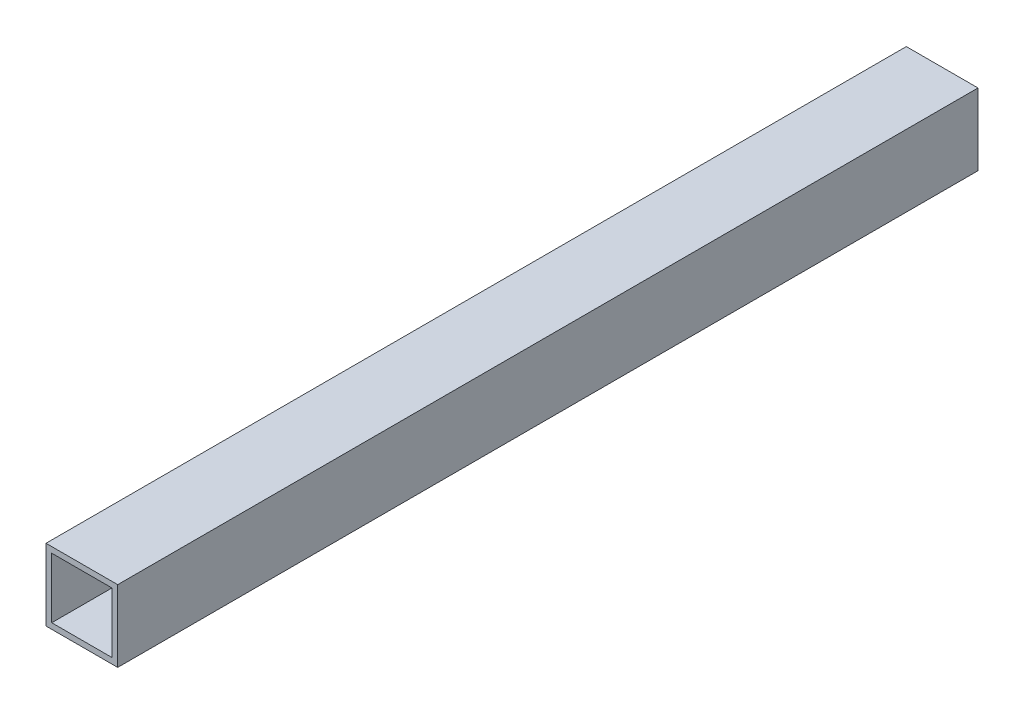
ISO-10303-21;
HEADER;
FILE_DESCRIPTION(('STEP AP214'),'2;1');
FILE_NAME('part.step','',(''),(''),'','','');
FILE_SCHEMA(('AUTOMOTIVE_DESIGN { 1 0 10303 214 1 1 1 1 }'));
ENDSEC;
DATA;
#1=APPLICATION_CONTEXT('core data for automotive mechanical design processes');
#2=APPLICATION_PROTOCOL_DEFINITION('international standard','automotive_design',2000,#1);
#3=PRODUCT_CONTEXT('',#1,'mechanical');
#4=PRODUCT('Part','Part','',(#3));
#5=PRODUCT_RELATED_PRODUCT_CATEGORY('part','',(#4));
#6=PRODUCT_DEFINITION_FORMATION('','',#4);
#7=PRODUCT_DEFINITION_CONTEXT('part definition',#1,'design');
#8=PRODUCT_DEFINITION('design','',#6,#7);
#9=PRODUCT_DEFINITION_SHAPE('','',#8);
#10=(LENGTH_UNIT() NAMED_UNIT(*) SI_UNIT(.MILLI.,.METRE.));
#11=(NAMED_UNIT(*) PLANE_ANGLE_UNIT() SI_UNIT($,.RADIAN.));
#12=(NAMED_UNIT(*) SI_UNIT($,.STERADIAN.) SOLID_ANGLE_UNIT());
#13=UNCERTAINTY_MEASURE_WITH_UNIT(LENGTH_MEASURE(1.E-05),#10,'distance_accuracy_value','');
#14=(GEOMETRIC_REPRESENTATION_CONTEXT(3) GLOBAL_UNCERTAINTY_ASSIGNED_CONTEXT((#13)) GLOBAL_UNIT_ASSIGNED_CONTEXT((#10,
#11,#12)) REPRESENTATION_CONTEXT('',''));
#15=CARTESIAN_POINT('',(0.,0.,0.));
#16=DIRECTION('',(0.,0.,1.));
#17=DIRECTION('',(1.,0.,0.));
#18=AXIS2_PLACEMENT_3D('',#15,#16,#17);
#19=CARTESIAN_POINT('',(0.,0.,300.));
#20=DIRECTION('',(0.,0.,-1.));
#21=DIRECTION('',(-1.,0.,0.));
#22=AXIS2_PLACEMENT_3D('',#19,#20,#21);
#23=PLANE('',#22);
#24=DIRECTION('',(0.,1.,0.));
#25=VECTOR('',#24,1.);
#26=CARTESIAN_POINT('',(12.5,-12.5,300.));
#27=LINE('',#26,#25);
#28=CARTESIAN_POINT('',(12.5,-12.5,300.));
#29=VERTEX_POINT('',#28);
#30=CARTESIAN_POINT('',(12.5,12.5,300.));
#31=VERTEX_POINT('',#30);
#32=EDGE_CURVE('E137',#29,#31,#27,.T.);
#33=ORIENTED_EDGE('',*,*,#32,.T.);
#34=DIRECTION('',(-1.,0.,0.));
#35=VECTOR('',#34,1.);
#36=CARTESIAN_POINT('',(-12.5,12.5,300.));
#37=LINE('',#36,#35);
#38=CARTESIAN_POINT('',(-12.5,12.5,300.));
#39=VERTEX_POINT('',#38);
#40=EDGE_CURVE('E140',#31,#39,#37,.T.);
#41=ORIENTED_EDGE('',*,*,#40,.T.);
#42=DIRECTION('',(0.,-1.,0.));
#43=VECTOR('',#42,1.);
#44=CARTESIAN_POINT('',(-12.5,-12.5,300.));
#45=LINE('',#44,#43);
#46=CARTESIAN_POINT('',(-12.5,-12.5,300.));
#47=VERTEX_POINT('',#46);
#48=EDGE_CURVE('E143',#39,#47,#45,.T.);
#49=ORIENTED_EDGE('',*,*,#48,.T.);
#50=DIRECTION('',(1.,0.,0.));
#51=VECTOR('',#50,1.);
#52=CARTESIAN_POINT('',(-12.5,-12.5,300.));
#53=LINE('',#52,#51);
#54=EDGE_CURVE('E145',#47,#29,#53,.T.);
#55=ORIENTED_EDGE('',*,*,#54,.T.);
#56=EDGE_LOOP('',(#33,#41,#49,#55));
#57=FACE_BOUND('',#56,.T.);
#58=DIRECTION('',(0.,1.,0.));
#59=VECTOR('',#58,1.);
#60=CARTESIAN_POINT('',(10.5,10.5,300.));
#61=LINE('',#60,#59);
#62=CARTESIAN_POINT('',(10.5,-10.5,300.));
#63=VERTEX_POINT('',#62);
#64=CARTESIAN_POINT('',(10.5,10.5,300.));
#65=VERTEX_POINT('',#64);
#66=EDGE_CURVE('E101',#63,#65,#61,.T.);
#67=ORIENTED_EDGE('',*,*,#66,.F.);
#68=DIRECTION('',(1.,0.,0.));
#69=VECTOR('',#68,1.);
#70=CARTESIAN_POINT('',(-10.5,-10.5,300.));
#71=LINE('',#70,#69);
#72=CARTESIAN_POINT('',(-10.5,-10.5,300.));
#73=VERTEX_POINT('',#72);
#74=EDGE_CURVE('E123',#73,#63,#71,.T.);
#75=ORIENTED_EDGE('',*,*,#74,.F.);
#76=DIRECTION('',(0.,-1.,0.));
#77=VECTOR('',#76,1.);
#78=CARTESIAN_POINT('',(-10.5,10.5,300.));
#79=LINE('',#78,#77);
#80=CARTESIAN_POINT('',(-10.5,10.5,300.));
#81=VERTEX_POINT('',#80);
#82=EDGE_CURVE('E121',#81,#73,#79,.T.);
#83=ORIENTED_EDGE('',*,*,#82,.F.);
#84=DIRECTION('',(-1.,0.,0.));
#85=VECTOR('',#84,1.);
#86=CARTESIAN_POINT('',(-10.5,10.5,300.));
#87=LINE('',#86,#85);
#88=EDGE_CURVE('E109',#65,#81,#87,.T.);
#89=ORIENTED_EDGE('',*,*,#88,.F.);
#90=EDGE_LOOP('',(#67,#75,#83,#89));
#91=FACE_BOUND('',#90,.T.);
#92=ADVANCED_FACE('F36',(#57,#91),#23,.F.);
#93=CARTESIAN_POINT('',(0.,0.,0.));
#94=DIRECTION('',(0.,0.,-1.));
#95=DIRECTION('',(-1.,0.,0.));
#96=AXIS2_PLACEMENT_3D('',#93,#94,#95);
#97=PLANE('',#96);
#98=DIRECTION('',(0.,1.,0.));
#99=VECTOR('',#98,1.);
#100=CARTESIAN_POINT('',(12.5,-12.5,0.));
#101=LINE('',#100,#99);
#102=CARTESIAN_POINT('',(12.5,-12.5,0.));
#103=VERTEX_POINT('',#102);
#104=CARTESIAN_POINT('',(12.5,12.5,0.));
#105=VERTEX_POINT('',#104);
#106=EDGE_CURVE('E117',#103,#105,#101,.T.);
#107=ORIENTED_EDGE('',*,*,#106,.F.);
#108=DIRECTION('',(1.,0.,0.));
#109=VECTOR('',#108,1.);
#110=CARTESIAN_POINT('',(-12.5,-12.5,0.));
#111=LINE('',#110,#109);
#112=CARTESIAN_POINT('',(-12.5,-12.5,0.));
#113=VERTEX_POINT('',#112);
#114=EDGE_CURVE('E141',#113,#103,#111,.T.);
#115=ORIENTED_EDGE('',*,*,#114,.F.);
#116=DIRECTION('',(0.,-1.,0.));
#117=VECTOR('',#116,1.);
#118=CARTESIAN_POINT('',(-12.5,-12.5,0.));
#119=LINE('',#118,#117);
#120=CARTESIAN_POINT('',(-12.5,12.5,0.));
#121=VERTEX_POINT('',#120);
#122=EDGE_CURVE('E152',#121,#113,#119,.T.);
#123=ORIENTED_EDGE('',*,*,#122,.F.);
#124=DIRECTION('',(-1.,0.,0.));
#125=VECTOR('',#124,1.);
#126=CARTESIAN_POINT('',(-12.5,12.5,0.));
#127=LINE('',#126,#125);
#128=EDGE_CURVE('E150',#105,#121,#127,.T.);
#129=ORIENTED_EDGE('',*,*,#128,.F.);
#130=EDGE_LOOP('',(#107,#115,#123,#129));
#131=FACE_BOUND('',#130,.T.);
#132=DIRECTION('',(1.,0.,0.));
#133=VECTOR('',#132,1.);
#134=CARTESIAN_POINT('',(-10.5,-10.5,0.));
#135=LINE('',#134,#133);
#136=CARTESIAN_POINT('',(-10.5,-10.5,0.));
#137=VERTEX_POINT('',#136);
#138=CARTESIAN_POINT('',(10.5,-10.5,0.));
#139=VERTEX_POINT('',#138);
#140=EDGE_CURVE('E110',#137,#139,#135,.T.);
#141=ORIENTED_EDGE('',*,*,#140,.T.);
#142=DIRECTION('',(0.,1.,0.));
#143=VECTOR('',#142,1.);
#144=CARTESIAN_POINT('',(10.5,10.5,0.));
#145=LINE('',#144,#143);
#146=CARTESIAN_POINT('',(10.5,10.5,0.));
#147=VERTEX_POINT('',#146);
#148=EDGE_CURVE('E59',#139,#147,#145,.T.);
#149=ORIENTED_EDGE('',*,*,#148,.T.);
#150=DIRECTION('',(-1.,0.,0.));
#151=VECTOR('',#150,1.);
#152=CARTESIAN_POINT('',(-10.5,10.5,0.));
#153=LINE('',#152,#151);
#154=CARTESIAN_POINT('',(-10.5,10.5,0.));
#155=VERTEX_POINT('',#154);
#156=EDGE_CURVE('E116',#147,#155,#153,.T.);
#157=ORIENTED_EDGE('',*,*,#156,.T.);
#158=DIRECTION('',(0.,-1.,0.));
#159=VECTOR('',#158,1.);
#160=CARTESIAN_POINT('',(-10.5,10.5,0.));
#161=LINE('',#160,#159);
#162=EDGE_CURVE('E129',#155,#137,#161,.T.);
#163=ORIENTED_EDGE('',*,*,#162,.T.);
#164=EDGE_LOOP('',(#141,#149,#157,#163));
#165=FACE_BOUND('',#164,.T.);
#166=ADVANCED_FACE('F170',(#131,#165),#97,.T.);
#167=CARTESIAN_POINT('',(12.5,-12.5,300.));
#168=DIRECTION('',(-1.,0.,0.));
#169=DIRECTION('',(0.,0.,1.));
#170=AXIS2_PLACEMENT_3D('',#167,#168,#169);
#171=PLANE('',#170);
#172=ORIENTED_EDGE('',*,*,#106,.T.);
#173=DIRECTION('',(0.,0.,-1.));
#174=VECTOR('',#173,1.);
#175=CARTESIAN_POINT('',(12.5,12.5,300.));
#176=LINE('',#175,#174);
#177=EDGE_CURVE('E11',#31,#105,#176,.T.);
#178=ORIENTED_EDGE('',*,*,#177,.F.);
#179=ORIENTED_EDGE('',*,*,#32,.F.);
#180=DIRECTION('',(0.,0.,-1.));
#181=VECTOR('',#180,1.);
#182=CARTESIAN_POINT('',(12.5,-12.5,300.));
#183=LINE('',#182,#181);
#184=EDGE_CURVE('E147',#29,#103,#183,.T.);
#185=ORIENTED_EDGE('',*,*,#184,.T.);
#186=EDGE_LOOP('',(#172,#178,#179,#185));
#187=FACE_BOUND('',#186,.T.);
#188=ADVANCED_FACE('F38',(#187),#171,.F.);
#189=CARTESIAN_POINT('',(-12.5,12.5,300.));
#190=DIRECTION('',(0.,-1.,0.));
#191=DIRECTION('',(0.,0.,-1.));
#192=AXIS2_PLACEMENT_3D('',#189,#190,#191);
#193=PLANE('',#192);
#194=ORIENTED_EDGE('',*,*,#128,.T.);
#195=DIRECTION('',(0.,0.,-1.));
#196=VECTOR('',#195,1.);
#197=CARTESIAN_POINT('',(-12.5,12.5,300.));
#198=LINE('',#197,#196);
#199=EDGE_CURVE('E44',#39,#121,#198,.T.);
#200=ORIENTED_EDGE('',*,*,#199,.F.);
#201=ORIENTED_EDGE('',*,*,#40,.F.);
#202=ORIENTED_EDGE('',*,*,#177,.T.);
#203=EDGE_LOOP('',(#194,#200,#201,#202));
#204=FACE_BOUND('',#203,.T.);
#205=ADVANCED_FACE('F180',(#204),#193,.F.);
#206=CARTESIAN_POINT('',(-12.5,-12.5,300.));
#207=DIRECTION('',(1.,0.,0.));
#208=DIRECTION('',(0.,0.,-1.));
#209=AXIS2_PLACEMENT_3D('',#206,#207,#208);
#210=PLANE('',#209);
#211=ORIENTED_EDGE('',*,*,#122,.T.);
#212=DIRECTION('',(0.,0.,-1.));
#213=VECTOR('',#212,1.);
#214=CARTESIAN_POINT('',(-12.5,-12.5,300.));
#215=LINE('',#214,#213);
#216=EDGE_CURVE('E157',#47,#113,#215,.T.);
#217=ORIENTED_EDGE('',*,*,#216,.F.);
#218=ORIENTED_EDGE('',*,*,#48,.F.);
#219=ORIENTED_EDGE('',*,*,#199,.T.);
#220=EDGE_LOOP('',(#211,#217,#218,#219));
#221=FACE_BOUND('',#220,.T.);
#222=ADVANCED_FACE('F164',(#221),#210,.F.);
#223=CARTESIAN_POINT('',(-12.5,-12.5,300.));
#224=DIRECTION('',(0.,1.,0.));
#225=DIRECTION('',(0.,0.,1.));
#226=AXIS2_PLACEMENT_3D('',#223,#224,#225);
#227=PLANE('',#226);
#228=ORIENTED_EDGE('',*,*,#114,.T.);
#229=ORIENTED_EDGE('',*,*,#184,.F.);
#230=ORIENTED_EDGE('',*,*,#54,.F.);
#231=ORIENTED_EDGE('',*,*,#216,.T.);
#232=EDGE_LOOP('',(#228,#229,#230,#231));
#233=FACE_BOUND('',#232,.T.);
#234=ADVANCED_FACE('F174',(#233),#227,.F.);
#235=CARTESIAN_POINT('',(10.5,10.5,300.));
#236=DIRECTION('',(-1.,0.,0.));
#237=DIRECTION('',(0.,0.,1.));
#238=AXIS2_PLACEMENT_3D('',#235,#236,#237);
#239=PLANE('',#238);
#240=ORIENTED_EDGE('',*,*,#148,.F.);
#241=DIRECTION('',(0.,0.,-1.));
#242=VECTOR('',#241,1.);
#243=CARTESIAN_POINT('',(10.5,-10.5,300.));
#244=LINE('',#243,#242);
#245=EDGE_CURVE('E105',#63,#139,#244,.T.);
#246=ORIENTED_EDGE('',*,*,#245,.F.);
#247=ORIENTED_EDGE('',*,*,#66,.T.);
#248=DIRECTION('',(0.,0.,-1.));
#249=VECTOR('',#248,1.);
#250=CARTESIAN_POINT('',(10.5,10.5,300.));
#251=LINE('',#250,#249);
#252=EDGE_CURVE('E104',#65,#147,#251,.T.);
#253=ORIENTED_EDGE('',*,*,#252,.T.);
#254=EDGE_LOOP('',(#240,#246,#247,#253));
#255=FACE_BOUND('',#254,.T.);
#256=ADVANCED_FACE('F103',(#255),#239,.T.);
#257=CARTESIAN_POINT('',(-10.5,10.5,300.));
#258=DIRECTION('',(0.,-1.,0.));
#259=DIRECTION('',(0.,0.,-1.));
#260=AXIS2_PLACEMENT_3D('',#257,#258,#259);
#261=PLANE('',#260);
#262=ORIENTED_EDGE('',*,*,#156,.F.);
#263=ORIENTED_EDGE('',*,*,#252,.F.);
#264=ORIENTED_EDGE('',*,*,#88,.T.);
#265=DIRECTION('',(0.,0.,-1.));
#266=VECTOR('',#265,1.);
#267=CARTESIAN_POINT('',(-10.5,10.5,300.));
#268=LINE('',#267,#266);
#269=EDGE_CURVE('E118',#81,#155,#268,.T.);
#270=ORIENTED_EDGE('',*,*,#269,.T.);
#271=EDGE_LOOP('',(#262,#263,#264,#270));
#272=FACE_BOUND('',#271,.T.);
#273=ADVANCED_FACE('F113',(#272),#261,.T.);
#274=CARTESIAN_POINT('',(-10.5,10.5,300.));
#275=DIRECTION('',(1.,0.,0.));
#276=DIRECTION('',(0.,0.,-1.));
#277=AXIS2_PLACEMENT_3D('',#274,#275,#276);
#278=PLANE('',#277);
#279=ORIENTED_EDGE('',*,*,#162,.F.);
#280=ORIENTED_EDGE('',*,*,#269,.F.);
#281=ORIENTED_EDGE('',*,*,#82,.T.);
#282=DIRECTION('',(0.,0.,-1.));
#283=VECTOR('',#282,1.);
#284=CARTESIAN_POINT('',(-10.5,-10.5,300.));
#285=LINE('',#284,#283);
#286=EDGE_CURVE('E51',#73,#137,#285,.T.);
#287=ORIENTED_EDGE('',*,*,#286,.T.);
#288=EDGE_LOOP('',(#279,#280,#281,#287));
#289=FACE_BOUND('',#288,.T.);
#290=ADVANCED_FACE('F203',(#289),#278,.T.);
#291=CARTESIAN_POINT('',(-10.5,-10.5,300.));
#292=DIRECTION('',(0.,1.,0.));
#293=DIRECTION('',(0.,0.,1.));
#294=AXIS2_PLACEMENT_3D('',#291,#292,#293);
#295=PLANE('',#294);
#296=ORIENTED_EDGE('',*,*,#140,.F.);
#297=ORIENTED_EDGE('',*,*,#286,.F.);
#298=ORIENTED_EDGE('',*,*,#74,.T.);
#299=ORIENTED_EDGE('',*,*,#245,.T.);
#300=EDGE_LOOP('',(#296,#297,#298,#299));
#301=FACE_BOUND('',#300,.T.);
#302=ADVANCED_FACE('F207',(#301),#295,.T.);
#303=CLOSED_SHELL('',(#92,#166,#188,#205,#222,#234,#256,#273,#290,#302));
#304=MANIFOLD_SOLID_BREP('B2',#303);
#305=ADVANCED_BREP_SHAPE_REPRESENTATION('',(#18,#304),#14);
#306=SHAPE_DEFINITION_REPRESENTATION(#9,#305);
ENDSEC;
END-ISO-10303-21;
